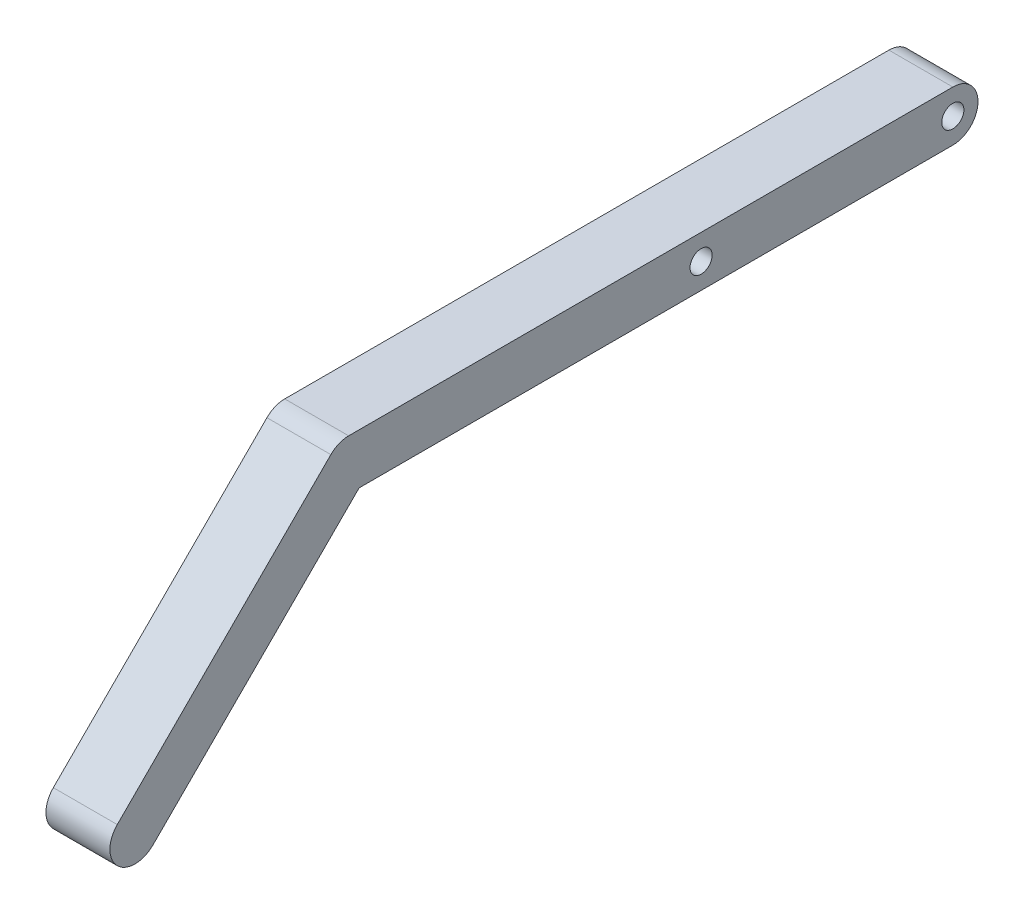
ISO-10303-21;
HEADER;
FILE_DESCRIPTION(('STEP AP214'),'2;1');
FILE_NAME('part.step','',(''),(''),'','','');
FILE_SCHEMA(('AUTOMOTIVE_DESIGN { 1 0 10303 214 1 1 1 1 }'));
ENDSEC;
DATA;
#1=APPLICATION_CONTEXT('core data for automotive mechanical design processes');
#2=APPLICATION_PROTOCOL_DEFINITION('international standard','automotive_design',2000,#1);
#3=PRODUCT_CONTEXT('',#1,'mechanical');
#4=PRODUCT('Part','Part','',(#3));
#5=PRODUCT_RELATED_PRODUCT_CATEGORY('part','',(#4));
#6=PRODUCT_DEFINITION_FORMATION('','',#4);
#7=PRODUCT_DEFINITION_CONTEXT('part definition',#1,'design');
#8=PRODUCT_DEFINITION('design','',#6,#7);
#9=PRODUCT_DEFINITION_SHAPE('','',#8);
#10=(LENGTH_UNIT() NAMED_UNIT(*) SI_UNIT(.MILLI.,.METRE.));
#11=(NAMED_UNIT(*) PLANE_ANGLE_UNIT() SI_UNIT($,.RADIAN.));
#12=(NAMED_UNIT(*) SI_UNIT($,.STERADIAN.) SOLID_ANGLE_UNIT());
#13=UNCERTAINTY_MEASURE_WITH_UNIT(LENGTH_MEASURE(1.E-05),#10,'distance_accuracy_value','');
#14=(GEOMETRIC_REPRESENTATION_CONTEXT(3) GLOBAL_UNCERTAINTY_ASSIGNED_CONTEXT((#13)) GLOBAL_UNIT_ASSIGNED_CONTEXT((#10,
#11,#12)) REPRESENTATION_CONTEXT('',''));
#15=CARTESIAN_POINT('',(0.,0.,0.));
#16=DIRECTION('',(0.,0.,1.));
#17=DIRECTION('',(1.,0.,0.));
#18=AXIS2_PLACEMENT_3D('',#15,#16,#17);
#19=CARTESIAN_POINT('',(12.7,107.573593128807,117.426406871193));
#20=DIRECTION('',(1.,0.,0.));
#21=DIRECTION('',(0.,0.,-1.));
#22=AXIS2_PLACEMENT_3D('',#19,#20,#21);
#23=PLANE('',#22);
#24=CARTESIAN_POINT('',(12.7,150.,-45.));
#25=DIRECTION('',(1.,0.,0.));
#26=DIRECTION('',(0.,0.,-1.));
#27=AXIS2_PLACEMENT_3D('',#24,#25,#26);
#28=CIRCLE('',#27,2.2);
#29=CARTESIAN_POINT('',(12.7,150.,-47.2));
#30=VERTEX_POINT('',#29);
#31=EDGE_CURVE('E140',#30,#30,#28,.T.);
#32=ORIENTED_EDGE('',*,*,#31,.F.);
#33=EDGE_LOOP('',(#32));
#34=FACE_BOUND('',#33,.T.);
#35=DIRECTION('',(0.,0.,-1.));
#36=VECTOR('',#35,1.);
#37=CARTESIAN_POINT('',(12.7,145.,-45.));
#38=LINE('',#37,#36);
#39=CARTESIAN_POINT('',(12.7,145.,72.9289321881345));
#40=VERTEX_POINT('',#39);
#41=CARTESIAN_POINT('',(12.7,145.,-45.));
#42=VERTEX_POINT('',#41);
#43=EDGE_CURVE('E155',#40,#42,#38,.T.);
#44=ORIENTED_EDGE('',*,*,#43,.T.);
#45=CARTESIAN_POINT('',(12.7,150.,-45.));
#46=DIRECTION('',(1.,0.,0.));
#47=DIRECTION('',(0.,0.,-1.));
#48=AXIS2_PLACEMENT_3D('',#45,#46,#47);
#49=CIRCLE('',#48,5.);
#50=CARTESIAN_POINT('',(12.7,155.,-45.));
#51=VERTEX_POINT('',#50);
#52=EDGE_CURVE('E97',#42,#51,#49,.T.);
#53=ORIENTED_EDGE('',*,*,#52,.T.);
#54=DIRECTION('',(0.,0.,1.));
#55=VECTOR('',#54,1.);
#56=CARTESIAN_POINT('',(12.7,155.,75.));
#57=LINE('',#56,#55);
#58=CARTESIAN_POINT('',(12.7,155.,75.));
#59=VERTEX_POINT('',#58);
#60=EDGE_CURVE('E172',#51,#59,#57,.T.);
#61=ORIENTED_EDGE('',*,*,#60,.T.);
#62=CARTESIAN_POINT('',(12.7,150.,75.));
#63=DIRECTION('',(1.,0.,0.));
#64=DIRECTION('',(0.,0.,-1.));
#65=AXIS2_PLACEMENT_3D('',#62,#63,#64);
#66=CIRCLE('',#65,5.00000000000002);
#67=CARTESIAN_POINT('',(12.7,153.535533905933,78.5355339059328));
#68=VERTEX_POINT('',#67);
#69=EDGE_CURVE('E113',#59,#68,#66,.T.);
#70=ORIENTED_EDGE('',*,*,#69,.T.);
#71=DIRECTION('',(0.,-0.707106781186549,0.707106781186546));
#72=VECTOR('',#71,1.);
#73=CARTESIAN_POINT('',(12.7,111.10912703474,120.961940777126));
#74=LINE('',#73,#72);
#75=CARTESIAN_POINT('',(12.7,111.10912703474,120.961940777126));
#76=VERTEX_POINT('',#75);
#77=EDGE_CURVE('E107',#68,#76,#74,.T.);
#78=ORIENTED_EDGE('',*,*,#77,.T.);
#79=CARTESIAN_POINT('',(12.7,107.573593128807,117.426406871193));
#80=DIRECTION('',(1.,0.,0.));
#81=DIRECTION('',(0.,0.,-1.));
#82=AXIS2_PLACEMENT_3D('',#79,#80,#81);
#83=CIRCLE('',#82,5.00000000000002);
#84=CARTESIAN_POINT('',(12.7,104.038059222874,113.89087296526));
#85=VERTEX_POINT('',#84);
#86=EDGE_CURVE('E111',#76,#85,#83,.T.);
#87=ORIENTED_EDGE('',*,*,#86,.T.);
#88=DIRECTION('',(0.,0.707106781186549,-0.707106781186546));
#89=VECTOR('',#88,1.);
#90=CARTESIAN_POINT('',(12.7,104.038059222874,113.89087296526));
#91=LINE('',#90,#89);
#92=EDGE_CURVE('E57',#85,#40,#91,.T.);
#93=ORIENTED_EDGE('',*,*,#92,.T.);
#94=EDGE_LOOP('',(#44,#53,#61,#70,#78,#87,#93));
#95=FACE_BOUND('',#94,.T.);
#96=CARTESIAN_POINT('',(12.7,150.,5.00000000000002));
#97=DIRECTION('',(1.,0.,0.));
#98=DIRECTION('',(0.,0.,-1.));
#99=AXIS2_PLACEMENT_3D('',#96,#97,#98);
#100=CIRCLE('',#99,2.2);
#101=CARTESIAN_POINT('',(12.7,150.,2.80000000000002));
#102=VERTEX_POINT('',#101);
#103=EDGE_CURVE('E192',#102,#102,#100,.T.);
#104=ORIENTED_EDGE('',*,*,#103,.F.);
#105=EDGE_LOOP('',(#104));
#106=FACE_BOUND('',#105,.T.);
#107=ADVANCED_FACE('F39',(#34,#95,#106),#23,.T.);
#108=CARTESIAN_POINT('',(0.,107.573593128807,117.426406871193));
#109=DIRECTION('',(1.,0.,0.));
#110=DIRECTION('',(0.,0.,-1.));
#111=AXIS2_PLACEMENT_3D('',#108,#109,#110);
#112=PLANE('',#111);
#113=DIRECTION('',(0.,0.,-1.));
#114=VECTOR('',#113,1.);
#115=CARTESIAN_POINT('',(0.,145.,-45.));
#116=LINE('',#115,#114);
#117=CARTESIAN_POINT('',(0.,145.,72.9289321881345));
#118=VERTEX_POINT('',#117);
#119=CARTESIAN_POINT('',(0.,145.,-45.));
#120=VERTEX_POINT('',#119);
#121=EDGE_CURVE('E135',#118,#120,#116,.T.);
#122=ORIENTED_EDGE('',*,*,#121,.F.);
#123=DIRECTION('',(0.,0.707106781186549,-0.707106781186546));
#124=VECTOR('',#123,1.);
#125=CARTESIAN_POINT('',(0.,104.038059222874,113.89087296526));
#126=LINE('',#125,#124);
#127=CARTESIAN_POINT('',(0.,104.038059222874,113.89087296526));
#128=VERTEX_POINT('',#127);
#129=EDGE_CURVE('E89',#128,#118,#126,.T.);
#130=ORIENTED_EDGE('',*,*,#129,.F.);
#131=CARTESIAN_POINT('',(0.,107.573593128807,117.426406871193));
#132=DIRECTION('',(1.,0.,0.));
#133=DIRECTION('',(0.,0.,-1.));
#134=AXIS2_PLACEMENT_3D('',#131,#132,#133);
#135=CIRCLE('',#134,5.00000000000002);
#136=CARTESIAN_POINT('',(0.,111.10912703474,120.961940777126));
#137=VERTEX_POINT('',#136);
#138=EDGE_CURVE('E83',#137,#128,#135,.T.);
#139=ORIENTED_EDGE('',*,*,#138,.F.);
#140=DIRECTION('',(0.,-0.707106781186549,0.707106781186546));
#141=VECTOR('',#140,1.);
#142=CARTESIAN_POINT('',(0.,111.10912703474,120.961940777126));
#143=LINE('',#142,#141);
#144=CARTESIAN_POINT('',(0.,153.535533905933,78.5355339059328));
#145=VERTEX_POINT('',#144);
#146=EDGE_CURVE('E122',#145,#137,#143,.T.);
#147=ORIENTED_EDGE('',*,*,#146,.F.);
#148=CARTESIAN_POINT('',(0.,150.,75.));
#149=DIRECTION('',(1.,0.,0.));
#150=DIRECTION('',(0.,0.,-1.));
#151=AXIS2_PLACEMENT_3D('',#148,#149,#150);
#152=CIRCLE('',#151,5.00000000000002);
#153=CARTESIAN_POINT('',(0.,155.,75.));
#154=VERTEX_POINT('',#153);
#155=EDGE_CURVE('E146',#154,#145,#152,.T.);
#156=ORIENTED_EDGE('',*,*,#155,.F.);
#157=DIRECTION('',(0.,0.,1.));
#158=VECTOR('',#157,1.);
#159=CARTESIAN_POINT('',(0.,155.,75.));
#160=LINE('',#159,#158);
#161=CARTESIAN_POINT('',(0.,155.,-45.));
#162=VERTEX_POINT('',#161);
#163=EDGE_CURVE('E143',#162,#154,#160,.T.);
#164=ORIENTED_EDGE('',*,*,#163,.F.);
#165=CARTESIAN_POINT('',(0.,150.,-45.));
#166=DIRECTION('',(1.,0.,0.));
#167=DIRECTION('',(0.,0.,-1.));
#168=AXIS2_PLACEMENT_3D('',#165,#166,#167);
#169=CIRCLE('',#168,5.);
#170=EDGE_CURVE('E139',#120,#162,#169,.T.);
#171=ORIENTED_EDGE('',*,*,#170,.F.);
#172=EDGE_LOOP('',(#122,#130,#139,#147,#156,#164,#171));
#173=FACE_BOUND('',#172,.T.);
#174=CARTESIAN_POINT('',(0.,150.,-45.));
#175=DIRECTION('',(1.,0.,0.));
#176=DIRECTION('',(0.,0.,-1.));
#177=AXIS2_PLACEMENT_3D('',#174,#175,#176);
#178=CIRCLE('',#177,2.2);
#179=CARTESIAN_POINT('',(0.,150.,-47.2));
#180=VERTEX_POINT('',#179);
#181=EDGE_CURVE('E188',#180,#180,#178,.T.);
#182=ORIENTED_EDGE('',*,*,#181,.T.);
#183=EDGE_LOOP('',(#182));
#184=FACE_BOUND('',#183,.T.);
#185=CARTESIAN_POINT('',(0.,150.,5.00000000000002));
#186=DIRECTION('',(1.,0.,0.));
#187=DIRECTION('',(0.,0.,-1.));
#188=AXIS2_PLACEMENT_3D('',#185,#186,#187);
#189=CIRCLE('',#188,2.2);
#190=CARTESIAN_POINT('',(0.,150.,2.80000000000002));
#191=VERTEX_POINT('',#190);
#192=EDGE_CURVE('E196',#191,#191,#189,.T.);
#193=ORIENTED_EDGE('',*,*,#192,.T.);
#194=EDGE_LOOP('',(#193));
#195=FACE_BOUND('',#194,.T.);
#196=ADVANCED_FACE('F176',(#173,#184,#195),#112,.F.);
#197=CARTESIAN_POINT('',(12.7,145.,-45.));
#198=DIRECTION('',(0.,1.,0.));
#199=DIRECTION('',(0.,0.,1.));
#200=AXIS2_PLACEMENT_3D('',#197,#198,#199);
#201=PLANE('',#200);
#202=ORIENTED_EDGE('',*,*,#121,.T.);
#203=DIRECTION('',(-1.,0.,0.));
#204=VECTOR('',#203,1.);
#205=CARTESIAN_POINT('',(12.7,145.,-45.));
#206=LINE('',#205,#204);
#207=EDGE_CURVE('E11',#42,#120,#206,.T.);
#208=ORIENTED_EDGE('',*,*,#207,.F.);
#209=ORIENTED_EDGE('',*,*,#43,.F.);
#210=DIRECTION('',(-1.,0.,0.));
#211=VECTOR('',#210,1.);
#212=CARTESIAN_POINT('',(12.7,145.,72.9289321881345));
#213=LINE('',#212,#211);
#214=EDGE_CURVE('E131',#40,#118,#213,.T.);
#215=ORIENTED_EDGE('',*,*,#214,.T.);
#216=EDGE_LOOP('',(#202,#208,#209,#215));
#217=FACE_BOUND('',#216,.T.);
#218=ADVANCED_FACE('F41',(#217),#201,.F.);
#219=CARTESIAN_POINT('',(12.7,150.,-45.));
#220=DIRECTION('',(-1.,0.,0.));
#221=DIRECTION('',(0.,0.,1.));
#222=AXIS2_PLACEMENT_3D('',#219,#220,#221);
#223=CYLINDRICAL_SURFACE('',#222,5.);
#224=ORIENTED_EDGE('',*,*,#170,.T.);
#225=DIRECTION('',(-1.,0.,0.));
#226=VECTOR('',#225,1.);
#227=CARTESIAN_POINT('',(12.7,155.,-45.));
#228=LINE('',#227,#226);
#229=EDGE_CURVE('E49',#51,#162,#228,.T.);
#230=ORIENTED_EDGE('',*,*,#229,.F.);
#231=ORIENTED_EDGE('',*,*,#52,.F.);
#232=ORIENTED_EDGE('',*,*,#207,.T.);
#233=EDGE_LOOP('',(#224,#230,#231,#232));
#234=FACE_BOUND('',#233,.T.);
#235=ADVANCED_FACE('F228',(#234),#223,.T.);
#236=CARTESIAN_POINT('',(12.7,155.,75.));
#237=DIRECTION('',(0.,-1.,0.));
#238=DIRECTION('',(0.,0.,-1.));
#239=AXIS2_PLACEMENT_3D('',#236,#237,#238);
#240=PLANE('',#239);
#241=ORIENTED_EDGE('',*,*,#163,.T.);
#242=DIRECTION('',(-1.,0.,0.));
#243=VECTOR('',#242,1.);
#244=CARTESIAN_POINT('',(12.7,155.,75.));
#245=LINE('',#244,#243);
#246=EDGE_CURVE('E162',#59,#154,#245,.T.);
#247=ORIENTED_EDGE('',*,*,#246,.F.);
#248=ORIENTED_EDGE('',*,*,#60,.F.);
#249=ORIENTED_EDGE('',*,*,#229,.T.);
#250=EDGE_LOOP('',(#241,#247,#248,#249));
#251=FACE_BOUND('',#250,.T.);
#252=ADVANCED_FACE('F170',(#251),#240,.F.);
#253=CARTESIAN_POINT('',(12.7,150.,75.));
#254=DIRECTION('',(-1.,0.,0.));
#255=DIRECTION('',(0.,0.,1.));
#256=AXIS2_PLACEMENT_3D('',#253,#254,#255);
#257=CYLINDRICAL_SURFACE('',#256,5.00000000000002);
#258=ORIENTED_EDGE('',*,*,#155,.T.);
#259=DIRECTION('',(-1.,0.,0.));
#260=VECTOR('',#259,1.);
#261=CARTESIAN_POINT('',(12.7,153.535533905933,78.5355339059328));
#262=LINE('',#261,#260);
#263=EDGE_CURVE('E124',#68,#145,#262,.T.);
#264=ORIENTED_EDGE('',*,*,#263,.F.);
#265=ORIENTED_EDGE('',*,*,#69,.F.);
#266=ORIENTED_EDGE('',*,*,#246,.T.);
#267=EDGE_LOOP('',(#258,#264,#265,#266));
#268=FACE_BOUND('',#267,.T.);
#269=ADVANCED_FACE('F179',(#268),#257,.T.);
#270=CARTESIAN_POINT('',(12.7,111.10912703474,120.961940777126));
#271=DIRECTION('',(0.,-0.707106781186546,-0.707106781186549));
#272=DIRECTION('',(0.,0.707106781186549,-0.707106781186546));
#273=AXIS2_PLACEMENT_3D('',#270,#271,#272);
#274=PLANE('',#273);
#275=ORIENTED_EDGE('',*,*,#146,.T.);
#276=DIRECTION('',(-1.,0.,0.));
#277=VECTOR('',#276,1.);
#278=CARTESIAN_POINT('',(12.7,111.10912703474,120.961940777126));
#279=LINE('',#278,#277);
#280=EDGE_CURVE('E119',#76,#137,#279,.T.);
#281=ORIENTED_EDGE('',*,*,#280,.F.);
#282=ORIENTED_EDGE('',*,*,#77,.F.);
#283=ORIENTED_EDGE('',*,*,#263,.T.);
#284=EDGE_LOOP('',(#275,#281,#282,#283));
#285=FACE_BOUND('',#284,.T.);
#286=ADVANCED_FACE('F120',(#285),#274,.F.);
#287=CARTESIAN_POINT('',(12.7,107.573593128807,117.426406871193));
#288=DIRECTION('',(-1.,0.,0.));
#289=DIRECTION('',(0.,0.,1.));
#290=AXIS2_PLACEMENT_3D('',#287,#288,#289);
#291=CYLINDRICAL_SURFACE('',#290,5.00000000000002);
#292=ORIENTED_EDGE('',*,*,#138,.T.);
#293=DIRECTION('',(-1.,0.,0.));
#294=VECTOR('',#293,1.);
#295=CARTESIAN_POINT('',(12.7,104.038059222874,113.89087296526));
#296=LINE('',#295,#294);
#297=EDGE_CURVE('E125',#85,#128,#296,.T.);
#298=ORIENTED_EDGE('',*,*,#297,.F.);
#299=ORIENTED_EDGE('',*,*,#86,.F.);
#300=ORIENTED_EDGE('',*,*,#280,.T.);
#301=EDGE_LOOP('',(#292,#298,#299,#300));
#302=FACE_BOUND('',#301,.T.);
#303=ADVANCED_FACE('F127',(#302),#291,.T.);
#304=CARTESIAN_POINT('',(12.7,104.038059222874,113.89087296526));
#305=DIRECTION('',(0.,0.707106781186546,0.707106781186549));
#306=DIRECTION('',(0.,-0.707106781186549,0.707106781186546));
#307=AXIS2_PLACEMENT_3D('',#304,#305,#306);
#308=PLANE('',#307);
#309=ORIENTED_EDGE('',*,*,#129,.T.);
#310=ORIENTED_EDGE('',*,*,#214,.F.);
#311=ORIENTED_EDGE('',*,*,#92,.F.);
#312=ORIENTED_EDGE('',*,*,#297,.T.);
#313=EDGE_LOOP('',(#309,#310,#311,#312));
#314=FACE_BOUND('',#313,.T.);
#315=ADVANCED_FACE('F218',(#314),#308,.F.);
#316=CARTESIAN_POINT('',(12.7,150.,-45.));
#317=DIRECTION('',(-1.,0.,0.));
#318=DIRECTION('',(0.,0.,1.));
#319=AXIS2_PLACEMENT_3D('',#316,#317,#318);
#320=CYLINDRICAL_SURFACE('',#319,2.2);
#321=ORIENTED_EDGE('',*,*,#31,.T.);
#322=EDGE_LOOP('',(#321));
#323=FACE_BOUND('',#322,.T.);
#324=ORIENTED_EDGE('',*,*,#181,.F.);
#325=EDGE_LOOP('',(#324));
#326=FACE_BOUND('',#325,.T.);
#327=ADVANCED_FACE('F215',(#323,#326),#320,.F.);
#328=CARTESIAN_POINT('',(12.7,150.,5.00000000000002));
#329=DIRECTION('',(-1.,0.,0.));
#330=DIRECTION('',(0.,0.,1.));
#331=AXIS2_PLACEMENT_3D('',#328,#329,#330);
#332=CYLINDRICAL_SURFACE('',#331,2.2);
#333=ORIENTED_EDGE('',*,*,#103,.T.);
#334=EDGE_LOOP('',(#333));
#335=FACE_BOUND('',#334,.T.);
#336=ORIENTED_EDGE('',*,*,#192,.F.);
#337=EDGE_LOOP('',(#336));
#338=FACE_BOUND('',#337,.T.);
#339=ADVANCED_FACE('F204',(#335,#338),#332,.F.);
#340=CLOSED_SHELL('',(#107,#196,#218,#235,#252,#269,#286,#303,#315,#327,#339));
#341=MANIFOLD_SOLID_BREP('B2',#340);
#342=ADVANCED_BREP_SHAPE_REPRESENTATION('',(#18,#341),#14);
#343=SHAPE_DEFINITION_REPRESENTATION(#9,#342);
ENDSEC;
END-ISO-10303-21;
